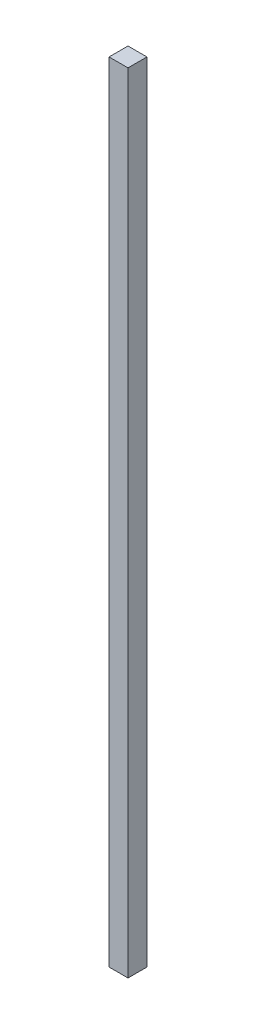
ISO-10303-21;
HEADER;
FILE_DESCRIPTION(('STEP AP214'),'2;1');
FILE_NAME('part.step','',(''),(''),'','','');
FILE_SCHEMA(('AUTOMOTIVE_DESIGN { 1 0 10303 214 1 1 1 1 }'));
ENDSEC;
DATA;
#1=APPLICATION_CONTEXT('core data for automotive mechanical design processes');
#2=APPLICATION_PROTOCOL_DEFINITION('international standard','automotive_design',2000,#1);
#3=PRODUCT_CONTEXT('',#1,'mechanical');
#4=PRODUCT('Part','Part','',(#3));
#5=PRODUCT_RELATED_PRODUCT_CATEGORY('part','',(#4));
#6=PRODUCT_DEFINITION_FORMATION('','',#4);
#7=PRODUCT_DEFINITION_CONTEXT('part definition',#1,'design');
#8=PRODUCT_DEFINITION('design','',#6,#7);
#9=PRODUCT_DEFINITION_SHAPE('','',#8);
#10=(LENGTH_UNIT() NAMED_UNIT(*) SI_UNIT(.MILLI.,.METRE.));
#11=(NAMED_UNIT(*) PLANE_ANGLE_UNIT() SI_UNIT($,.RADIAN.));
#12=(NAMED_UNIT(*) SI_UNIT($,.STERADIAN.) SOLID_ANGLE_UNIT());
#13=UNCERTAINTY_MEASURE_WITH_UNIT(LENGTH_MEASURE(1.E-05),#10,'distance_accuracy_value','');
#14=(GEOMETRIC_REPRESENTATION_CONTEXT(3) GLOBAL_UNCERTAINTY_ASSIGNED_CONTEXT((#13)) GLOBAL_UNIT_ASSIGNED_CONTEXT((#10,
#11,#12)) REPRESENTATION_CONTEXT('',''));
#15=CARTESIAN_POINT('',(0.,0.,0.));
#16=DIRECTION('',(0.,0.,1.));
#17=DIRECTION('',(1.,0.,0.));
#18=AXIS2_PLACEMENT_3D('',#15,#16,#17);
#19=CARTESIAN_POINT('',(3.,125.,3.));
#20=DIRECTION('',(-1.,0.,0.));
#21=DIRECTION('',(0.,0.,-1.));
#22=AXIS2_PLACEMENT_3D('',#19,#20,#21);
#23=PLANE('',#22);
#24=DIRECTION('',(0.,0.,1.));
#25=VECTOR('',#24,1.);
#26=CARTESIAN_POINT('',(3.,-125.,3.));
#27=LINE('',#26,#25);
#28=CARTESIAN_POINT('',(3.,-125.,-3.));
#29=VERTEX_POINT('',#28);
#30=CARTESIAN_POINT('',(3.,-125.,3.));
#31=VERTEX_POINT('',#30);
#32=EDGE_CURVE('E106',#29,#31,#27,.T.);
#33=ORIENTED_EDGE('',*,*,#32,.F.);
#34=DIRECTION('',(0.,-1.,0.));
#35=VECTOR('',#34,1.);
#36=CARTESIAN_POINT('',(3.,125.,-3.));
#37=LINE('',#36,#35);
#38=CARTESIAN_POINT('',(3.,125.,-3.));
#39=VERTEX_POINT('',#38);
#40=EDGE_CURVE('E105',#39,#29,#37,.T.);
#41=ORIENTED_EDGE('',*,*,#40,.F.);
#42=DIRECTION('',(0.,0.,1.));
#43=VECTOR('',#42,1.);
#44=CARTESIAN_POINT('',(3.,125.,3.));
#45=LINE('',#44,#43);
#46=CARTESIAN_POINT('',(3.,125.,3.));
#47=VERTEX_POINT('',#46);
#48=EDGE_CURVE('E100',#39,#47,#45,.T.);
#49=ORIENTED_EDGE('',*,*,#48,.T.);
#50=DIRECTION('',(0.,-1.,0.));
#51=VECTOR('',#50,1.);
#52=CARTESIAN_POINT('',(3.,125.,3.));
#53=LINE('',#52,#51);
#54=EDGE_CURVE('E11',#47,#31,#53,.T.);
#55=ORIENTED_EDGE('',*,*,#54,.T.);
#56=EDGE_LOOP('',(#33,#41,#49,#55));
#57=FACE_BOUND('',#56,.T.);
#58=ADVANCED_FACE('F43',(#57),#23,.F.);
#59=CARTESIAN_POINT('',(-3.,125.,3.));
#60=DIRECTION('',(0.,0.,-1.));
#61=DIRECTION('',(1.,0.,0.));
#62=AXIS2_PLACEMENT_3D('',#59,#60,#61);
#63=PLANE('',#62);
#64=DIRECTION('',(-1.,0.,0.));
#65=VECTOR('',#64,1.);
#66=CARTESIAN_POINT('',(-3.,-125.,3.));
#67=LINE('',#66,#65);
#68=CARTESIAN_POINT('',(-3.,-125.,3.));
#69=VERTEX_POINT('',#68);
#70=EDGE_CURVE('E108',#31,#69,#67,.T.);
#71=ORIENTED_EDGE('',*,*,#70,.F.);
#72=ORIENTED_EDGE('',*,*,#54,.F.);
#73=DIRECTION('',(-1.,0.,0.));
#74=VECTOR('',#73,1.);
#75=CARTESIAN_POINT('',(-3.,125.,3.));
#76=LINE('',#75,#74);
#77=CARTESIAN_POINT('',(-3.,125.,3.));
#78=VERTEX_POINT('',#77);
#79=EDGE_CURVE('E84',#47,#78,#76,.T.);
#80=ORIENTED_EDGE('',*,*,#79,.T.);
#81=DIRECTION('',(0.,-1.,0.));
#82=VECTOR('',#81,1.);
#83=CARTESIAN_POINT('',(-3.,125.,3.));
#84=LINE('',#83,#82);
#85=EDGE_CURVE('E51',#78,#69,#84,.T.);
#86=ORIENTED_EDGE('',*,*,#85,.T.);
#87=EDGE_LOOP('',(#71,#72,#80,#86));
#88=FACE_BOUND('',#87,.T.);
#89=ADVANCED_FACE('F98',(#88),#63,.F.);
#90=CARTESIAN_POINT('',(-3.,125.,3.));
#91=DIRECTION('',(1.,0.,0.));
#92=DIRECTION('',(0.,0.,1.));
#93=AXIS2_PLACEMENT_3D('',#90,#91,#92);
#94=PLANE('',#93);
#95=DIRECTION('',(0.,0.,-1.));
#96=VECTOR('',#95,1.);
#97=CARTESIAN_POINT('',(-3.,-125.,3.));
#98=LINE('',#97,#96);
#99=CARTESIAN_POINT('',(-3.,-125.,-3.));
#100=VERTEX_POINT('',#99);
#101=EDGE_CURVE('E94',#69,#100,#98,.T.);
#102=ORIENTED_EDGE('',*,*,#101,.F.);
#103=ORIENTED_EDGE('',*,*,#85,.F.);
#104=DIRECTION('',(0.,0.,-1.));
#105=VECTOR('',#104,1.);
#106=CARTESIAN_POINT('',(-3.,125.,3.));
#107=LINE('',#106,#105);
#108=CARTESIAN_POINT('',(-3.,125.,-3.));
#109=VERTEX_POINT('',#108);
#110=EDGE_CURVE('E87',#78,#109,#107,.T.);
#111=ORIENTED_EDGE('',*,*,#110,.T.);
#112=DIRECTION('',(0.,-1.,0.));
#113=VECTOR('',#112,1.);
#114=CARTESIAN_POINT('',(-3.,125.,-3.));
#115=LINE('',#114,#113);
#116=EDGE_CURVE('E97',#109,#100,#115,.T.);
#117=ORIENTED_EDGE('',*,*,#116,.T.);
#118=EDGE_LOOP('',(#102,#103,#111,#117));
#119=FACE_BOUND('',#118,.T.);
#120=ADVANCED_FACE('F93',(#119),#94,.F.);
#121=CARTESIAN_POINT('',(-3.,125.,-3.));
#122=DIRECTION('',(0.,0.,1.));
#123=DIRECTION('',(-1.,0.,0.));
#124=AXIS2_PLACEMENT_3D('',#121,#122,#123);
#125=PLANE('',#124);
#126=DIRECTION('',(1.,0.,0.));
#127=VECTOR('',#126,1.);
#128=CARTESIAN_POINT('',(-3.,-125.,-3.));
#129=LINE('',#128,#127);
#130=EDGE_CURVE('E73',#100,#29,#129,.T.);
#131=ORIENTED_EDGE('',*,*,#130,.F.);
#132=ORIENTED_EDGE('',*,*,#116,.F.);
#133=DIRECTION('',(1.,0.,0.));
#134=VECTOR('',#133,1.);
#135=CARTESIAN_POINT('',(-3.,125.,-3.));
#136=LINE('',#135,#134);
#137=EDGE_CURVE('E59',#109,#39,#136,.T.);
#138=ORIENTED_EDGE('',*,*,#137,.T.);
#139=ORIENTED_EDGE('',*,*,#40,.T.);
#140=EDGE_LOOP('',(#131,#132,#138,#139));
#141=FACE_BOUND('',#140,.T.);
#142=ADVANCED_FACE('F117',(#141),#125,.F.);
#143=CARTESIAN_POINT('',(0.,125.,0.));
#144=DIRECTION('',(0.,1.,0.));
#145=DIRECTION('',(0.,0.,-1.));
#146=AXIS2_PLACEMENT_3D('',#143,#144,#145);
#147=PLANE('',#146);
#148=ORIENTED_EDGE('',*,*,#48,.F.);
#149=ORIENTED_EDGE('',*,*,#137,.F.);
#150=ORIENTED_EDGE('',*,*,#110,.F.);
#151=ORIENTED_EDGE('',*,*,#79,.F.);
#152=EDGE_LOOP('',(#148,#149,#150,#151));
#153=FACE_BOUND('',#152,.T.);
#154=ADVANCED_FACE('F89',(#153),#147,.T.);
#155=CARTESIAN_POINT('',(0.,-125.,0.));
#156=DIRECTION('',(0.,1.,0.));
#157=DIRECTION('',(0.,0.,-1.));
#158=AXIS2_PLACEMENT_3D('',#155,#156,#157);
#159=PLANE('',#158);
#160=ORIENTED_EDGE('',*,*,#32,.T.);
#161=ORIENTED_EDGE('',*,*,#70,.T.);
#162=ORIENTED_EDGE('',*,*,#101,.T.);
#163=ORIENTED_EDGE('',*,*,#130,.T.);
#164=EDGE_LOOP('',(#160,#161,#162,#163));
#165=FACE_BOUND('',#164,.T.);
#166=ADVANCED_FACE('F113',(#165),#159,.F.);
#167=CLOSED_SHELL('',(#58,#89,#120,#142,#154,#166));
#168=MANIFOLD_SOLID_BREP('B2',#167);
#169=ADVANCED_BREP_SHAPE_REPRESENTATION('',(#18,#168),#14);
#170=SHAPE_DEFINITION_REPRESENTATION(#9,#169);
ENDSEC;
END-ISO-10303-21;
